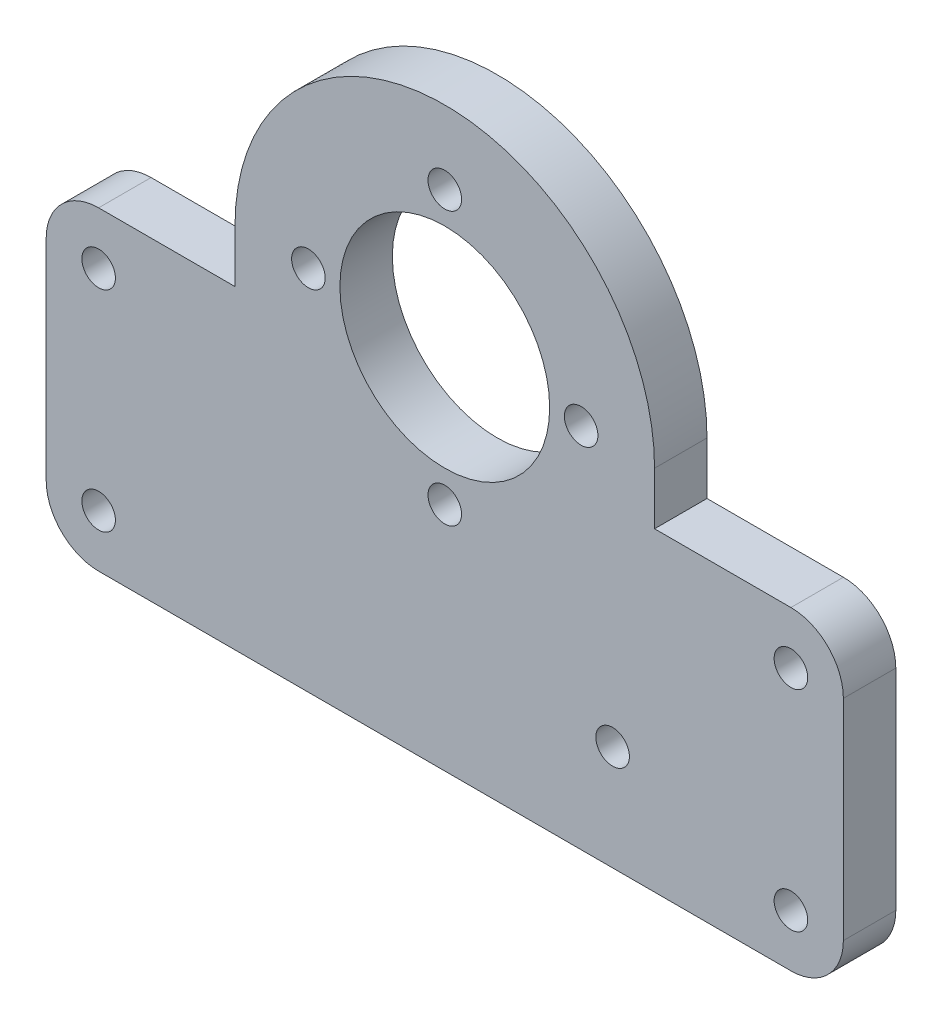
ISO-10303-21;
HEADER;
FILE_DESCRIPTION(('STEP AP214'),'2;1');
FILE_NAME('part.step','',(''),(''),'','','');
FILE_SCHEMA(('AUTOMOTIVE_DESIGN { 1 0 10303 214 1 1 1 1 }'));
ENDSEC;
DATA;
#1=APPLICATION_CONTEXT('core data for automotive mechanical design processes');
#2=APPLICATION_PROTOCOL_DEFINITION('international standard','automotive_design',2000,#1);
#3=PRODUCT_CONTEXT('',#1,'mechanical');
#4=PRODUCT('Part','Part','',(#3));
#5=PRODUCT_RELATED_PRODUCT_CATEGORY('part','',(#4));
#6=PRODUCT_DEFINITION_FORMATION('','',#4);
#7=PRODUCT_DEFINITION_CONTEXT('part definition',#1,'design');
#8=PRODUCT_DEFINITION('design','',#6,#7);
#9=PRODUCT_DEFINITION_SHAPE('','',#8);
#10=(LENGTH_UNIT() NAMED_UNIT(*) SI_UNIT(.MILLI.,.METRE.));
#11=(NAMED_UNIT(*) PLANE_ANGLE_UNIT() SI_UNIT($,.RADIAN.));
#12=(NAMED_UNIT(*) SI_UNIT($,.STERADIAN.) SOLID_ANGLE_UNIT());
#13=UNCERTAINTY_MEASURE_WITH_UNIT(LENGTH_MEASURE(1.E-05),#10,'distance_accuracy_value','');
#14=(GEOMETRIC_REPRESENTATION_CONTEXT(3) GLOBAL_UNCERTAINTY_ASSIGNED_CONTEXT((#13)) GLOBAL_UNIT_ASSIGNED_CONTEXT((#10,
#11,#12)) REPRESENTATION_CONTEXT('',''));
#15=CARTESIAN_POINT('',(0.,0.,0.));
#16=DIRECTION('',(0.,0.,1.));
#17=DIRECTION('',(1.,0.,0.));
#18=AXIS2_PLACEMENT_3D('',#15,#16,#17);
#19=CARTESIAN_POINT('',(38.,-30.,5.));
#20=DIRECTION('',(-1.,0.,0.));
#21=DIRECTION('',(0.,0.,1.));
#22=AXIS2_PLACEMENT_3D('',#19,#20,#21);
#23=PLANE('',#22);
#24=DIRECTION('',(0.,1.,0.));
#25=VECTOR('',#24,1.);
#26=CARTESIAN_POINT('',(38.,-30.,0.));
#27=LINE('',#26,#25);
#28=CARTESIAN_POINT('',(38.,-25.,0.));
#29=VERTEX_POINT('',#28);
#30=CARTESIAN_POINT('',(38.,-5.,0.));
#31=VERTEX_POINT('',#30);
#32=EDGE_CURVE('E287',#29,#31,#27,.T.);
#33=ORIENTED_EDGE('',*,*,#32,.T.);
#34=DIRECTION('',(0.,0.,-1.));
#35=VECTOR('',#34,1.);
#36=CARTESIAN_POINT('',(38.,-5.,5.));
#37=LINE('',#36,#35);
#38=CARTESIAN_POINT('',(38.,-5.,5.));
#39=VERTEX_POINT('',#38);
#40=EDGE_CURVE('E12',#31,#39,#37,.F.);
#41=ORIENTED_EDGE('',*,*,#40,.T.);
#42=DIRECTION('',(0.,1.,0.));
#43=VECTOR('',#42,1.);
#44=CARTESIAN_POINT('',(38.,-30.,5.));
#45=LINE('',#44,#43);
#46=CARTESIAN_POINT('',(38.,-25.,5.));
#47=VERTEX_POINT('',#46);
#48=EDGE_CURVE('E301',#47,#39,#45,.T.);
#49=ORIENTED_EDGE('',*,*,#48,.F.);
#50=DIRECTION('',(0.,0.,-1.));
#51=VECTOR('',#50,1.);
#52=CARTESIAN_POINT('',(38.,-25.,5.));
#53=LINE('',#52,#51);
#54=EDGE_CURVE('E335',#47,#29,#53,.T.);
#55=ORIENTED_EDGE('',*,*,#54,.T.);
#56=EDGE_LOOP('',(#33,#41,#49,#55));
#57=FACE_BOUND('',#56,.T.);
#58=ADVANCED_FACE('F37',(#57),#23,.F.);
#59=CARTESIAN_POINT('',(-38.,-30.,5.));
#60=DIRECTION('',(1.,0.,0.));
#61=DIRECTION('',(0.,0.,-1.));
#62=AXIS2_PLACEMENT_3D('',#59,#60,#61);
#63=PLANE('',#62);
#64=DIRECTION('',(0.,-1.,0.));
#65=VECTOR('',#64,1.);
#66=CARTESIAN_POINT('',(-38.,-30.,5.));
#67=LINE('',#66,#65);
#68=CARTESIAN_POINT('',(-38.,-5.,5.));
#69=VERTEX_POINT('',#68);
#70=CARTESIAN_POINT('',(-38.,-25.,5.));
#71=VERTEX_POINT('',#70);
#72=EDGE_CURVE('E298',#69,#71,#67,.T.);
#73=ORIENTED_EDGE('',*,*,#72,.F.);
#74=DIRECTION('',(0.,0.,-1.));
#75=VECTOR('',#74,1.);
#76=CARTESIAN_POINT('',(-38.,-5.,5.));
#77=LINE('',#76,#75);
#78=CARTESIAN_POINT('',(-38.,-5.,0.));
#79=VERTEX_POINT('',#78);
#80=EDGE_CURVE('E338',#69,#79,#77,.T.);
#81=ORIENTED_EDGE('',*,*,#80,.T.);
#82=DIRECTION('',(0.,-1.,0.));
#83=VECTOR('',#82,1.);
#84=CARTESIAN_POINT('',(-38.,-30.,0.));
#85=LINE('',#84,#83);
#86=CARTESIAN_POINT('',(-38.,-25.,0.));
#87=VERTEX_POINT('',#86);
#88=EDGE_CURVE('E314',#79,#87,#85,.T.);
#89=ORIENTED_EDGE('',*,*,#88,.T.);
#90=DIRECTION('',(0.,0.,-1.));
#91=VECTOR('',#90,1.);
#92=CARTESIAN_POINT('',(-38.,-25.,5.));
#93=LINE('',#92,#91);
#94=EDGE_CURVE('E328',#87,#71,#93,.F.);
#95=ORIENTED_EDGE('',*,*,#94,.T.);
#96=EDGE_LOOP('',(#73,#81,#89,#95));
#97=FACE_BOUND('',#96,.T.);
#98=ADVANCED_FACE('F357',(#97),#63,.F.);
#99=CARTESIAN_POINT('',(-38.,-30.,5.));
#100=DIRECTION('',(0.,1.,0.));
#101=DIRECTION('',(0.,0.,1.));
#102=AXIS2_PLACEMENT_3D('',#99,#100,#101);
#103=PLANE('',#102);
#104=DIRECTION('',(1.,0.,0.));
#105=VECTOR('',#104,1.);
#106=CARTESIAN_POINT('',(-38.,-30.,5.));
#107=LINE('',#106,#105);
#108=CARTESIAN_POINT('',(-33.,-30.,5.));
#109=VERTEX_POINT('',#108);
#110=CARTESIAN_POINT('',(33.,-30.,5.));
#111=VERTEX_POINT('',#110);
#112=EDGE_CURVE('E300',#109,#111,#107,.T.);
#113=ORIENTED_EDGE('',*,*,#112,.F.);
#114=DIRECTION('',(0.,0.,-1.));
#115=VECTOR('',#114,1.);
#116=CARTESIAN_POINT('',(-33.,-30.,5.));
#117=LINE('',#116,#115);
#118=CARTESIAN_POINT('',(-33.,-30.,0.));
#119=VERTEX_POINT('',#118);
#120=EDGE_CURVE('E320',#109,#119,#117,.T.);
#121=ORIENTED_EDGE('',*,*,#120,.T.);
#122=DIRECTION('',(1.,0.,0.));
#123=VECTOR('',#122,1.);
#124=CARTESIAN_POINT('',(-38.,-30.,0.));
#125=LINE('',#124,#123);
#126=CARTESIAN_POINT('',(33.,-30.,0.));
#127=VERTEX_POINT('',#126);
#128=EDGE_CURVE('E316',#119,#127,#125,.T.);
#129=ORIENTED_EDGE('',*,*,#128,.T.);
#130=DIRECTION('',(0.,0.,-1.));
#131=VECTOR('',#130,1.);
#132=CARTESIAN_POINT('',(33.,-30.,5.));
#133=LINE('',#132,#131);
#134=EDGE_CURVE('E310',#127,#111,#133,.F.);
#135=ORIENTED_EDGE('',*,*,#134,.T.);
#136=EDGE_LOOP('',(#113,#121,#129,#135));
#137=FACE_BOUND('',#136,.T.);
#138=ADVANCED_FACE('F381',(#137),#103,.F.);
#139=CARTESIAN_POINT('',(0.,0.,5.));
#140=DIRECTION('',(0.,0.,-1.));
#141=DIRECTION('',(-1.,0.,0.));
#142=AXIS2_PLACEMENT_3D('',#139,#140,#141);
#143=PLANE('',#142);
#144=CARTESIAN_POINT('',(16.,-20.,5.));
#145=DIRECTION('',(0.,0.,1.));
#146=DIRECTION('',(1.,0.,0.));
#147=AXIS2_PLACEMENT_3D('',#144,#145,#146);
#148=CIRCLE('',#147,1.6);
#149=CARTESIAN_POINT('',(17.6,-20.,5.));
#150=VERTEX_POINT('',#149);
#151=EDGE_CURVE('E202',#150,#150,#148,.T.);
#152=ORIENTED_EDGE('',*,*,#151,.F.);
#153=EDGE_LOOP('',(#152));
#154=FACE_BOUND('',#153,.T.);
#155=CARTESIAN_POINT('',(0.,18.,5.));
#156=DIRECTION('',(0.,0.,-1.));
#157=DIRECTION('',(-1.,0.,0.));
#158=AXIS2_PLACEMENT_3D('',#155,#156,#157);
#159=CIRCLE('',#158,1.6);
#160=CARTESIAN_POINT('',(-1.6,18.,5.));
#161=VERTEX_POINT('',#160);
#162=EDGE_CURVE('E213',#161,#161,#159,.T.);
#163=ORIENTED_EDGE('',*,*,#162,.T.);
#164=EDGE_LOOP('',(#163));
#165=FACE_BOUND('',#164,.T.);
#166=CARTESIAN_POINT('',(-13.0000000000002,5.00000000000014,5.));
#167=DIRECTION('',(0.,0.,-1.));
#168=DIRECTION('',(-1.,0.,0.));
#169=AXIS2_PLACEMENT_3D('',#166,#167,#168);
#170=CIRCLE('',#169,1.6);
#171=CARTESIAN_POINT('',(-14.6000000000002,5.00000000000014,5.));
#172=VERTEX_POINT('',#171);
#173=EDGE_CURVE('E218',#172,#172,#170,.T.);
#174=ORIENTED_EDGE('',*,*,#173,.T.);
#175=EDGE_LOOP('',(#174));
#176=FACE_BOUND('',#175,.T.);
#177=CARTESIAN_POINT('',(-2.73805120588741E-13,-8.,5.));
#178=DIRECTION('',(0.,0.,-1.));
#179=DIRECTION('',(-1.,0.,0.));
#180=AXIS2_PLACEMENT_3D('',#177,#178,#179);
#181=CIRCLE('',#180,1.6);
#182=CARTESIAN_POINT('',(-1.60000000000027,-8.,5.));
#183=VERTEX_POINT('',#182);
#184=EDGE_CURVE('E231',#183,#183,#181,.T.);
#185=ORIENTED_EDGE('',*,*,#184,.T.);
#186=EDGE_LOOP('',(#185));
#187=FACE_BOUND('',#186,.T.);
#188=CARTESIAN_POINT('',(12.9999999999998,4.99999999999996,5.));
#189=DIRECTION('',(0.,0.,-1.));
#190=DIRECTION('',(-1.,0.,0.));
#191=AXIS2_PLACEMENT_3D('',#188,#189,#190);
#192=CIRCLE('',#191,1.6);
#193=CARTESIAN_POINT('',(11.3999999999998,4.99999999999996,5.));
#194=VERTEX_POINT('',#193);
#195=EDGE_CURVE('E234',#194,#194,#192,.T.);
#196=ORIENTED_EDGE('',*,*,#195,.T.);
#197=EDGE_LOOP('',(#196));
#198=FACE_BOUND('',#197,.T.);
#199=CARTESIAN_POINT('',(0.,5.,5.));
#200=DIRECTION('',(0.,0.,-1.));
#201=DIRECTION('',(-1.,0.,0.));
#202=AXIS2_PLACEMENT_3D('',#199,#200,#201);
#203=CIRCLE('',#202,10.);
#204=CARTESIAN_POINT('',(-10.,5.,5.));
#205=VERTEX_POINT('',#204);
#206=EDGE_CURVE('E246',#205,#205,#203,.T.);
#207=ORIENTED_EDGE('',*,*,#206,.T.);
#208=EDGE_LOOP('',(#207));
#209=FACE_BOUND('',#208,.T.);
#210=CARTESIAN_POINT('',(33.,-25.,5.));
#211=DIRECTION('',(0.,0.,-1.));
#212=DIRECTION('',(-1.,0.,0.));
#213=AXIS2_PLACEMENT_3D('',#210,#211,#212);
#214=CIRCLE('',#213,1.6);
#215=CARTESIAN_POINT('',(31.4,-25.,5.));
#216=VERTEX_POINT('',#215);
#217=EDGE_CURVE('E260',#216,#216,#214,.T.);
#218=ORIENTED_EDGE('',*,*,#217,.T.);
#219=EDGE_LOOP('',(#218));
#220=FACE_BOUND('',#219,.T.);
#221=CARTESIAN_POINT('',(-33.,-5.,5.));
#222=DIRECTION('',(0.,0.,-1.));
#223=DIRECTION('',(-1.,0.,0.));
#224=AXIS2_PLACEMENT_3D('',#221,#222,#223);
#225=CIRCLE('',#224,1.6);
#226=CARTESIAN_POINT('',(-34.6,-5.,5.));
#227=VERTEX_POINT('',#226);
#228=EDGE_CURVE('E271',#227,#227,#225,.T.);
#229=ORIENTED_EDGE('',*,*,#228,.T.);
#230=EDGE_LOOP('',(#229));
#231=FACE_BOUND('',#230,.T.);
#232=CARTESIAN_POINT('',(-33.,-25.,5.));
#233=DIRECTION('',(0.,0.,-1.));
#234=DIRECTION('',(-1.,0.,0.));
#235=AXIS2_PLACEMENT_3D('',#232,#233,#234);
#236=CIRCLE('',#235,1.6);
#237=CARTESIAN_POINT('',(-34.6,-25.,5.));
#238=VERTEX_POINT('',#237);
#239=EDGE_CURVE('E221',#238,#238,#236,.T.);
#240=ORIENTED_EDGE('',*,*,#239,.T.);
#241=EDGE_LOOP('',(#240));
#242=FACE_BOUND('',#241,.T.);
#243=CARTESIAN_POINT('',(33.,-5.,5.));
#244=DIRECTION('',(0.,0.,-1.));
#245=DIRECTION('',(-1.,0.,0.));
#246=AXIS2_PLACEMENT_3D('',#243,#244,#245);
#247=CIRCLE('',#246,1.6);
#248=CARTESIAN_POINT('',(31.4,-5.,5.));
#249=VERTEX_POINT('',#248);
#250=EDGE_CURVE('E283',#249,#249,#247,.T.);
#251=ORIENTED_EDGE('',*,*,#250,.T.);
#252=EDGE_LOOP('',(#251));
#253=FACE_BOUND('',#252,.T.);
#254=DIRECTION('',(-1.,0.,0.));
#255=VECTOR('',#254,1.);
#256=CARTESIAN_POINT('',(0.,0.,5.));
#257=LINE('',#256,#255);
#258=CARTESIAN_POINT('',(-20.,0.,5.));
#259=VERTEX_POINT('',#258);
#260=CARTESIAN_POINT('',(-33.,0.,5.));
#261=VERTEX_POINT('',#260);
#262=EDGE_CURVE('E191',#259,#261,#257,.T.);
#263=ORIENTED_EDGE('',*,*,#262,.T.);
#264=CARTESIAN_POINT('',(-33.,-5.,5.));
#265=DIRECTION('',(0.,0.,-1.));
#266=DIRECTION('',(-1.,0.,0.));
#267=AXIS2_PLACEMENT_3D('',#264,#265,#266);
#268=CIRCLE('',#267,5.);
#269=EDGE_CURVE('E348',#261,#69,#268,.F.);
#270=ORIENTED_EDGE('',*,*,#269,.T.);
#271=ORIENTED_EDGE('',*,*,#72,.T.);
#272=CARTESIAN_POINT('',(-33.,-25.,5.));
#273=DIRECTION('',(0.,0.,-1.));
#274=DIRECTION('',(-1.,0.,0.));
#275=AXIS2_PLACEMENT_3D('',#272,#273,#274);
#276=CIRCLE('',#275,5.);
#277=EDGE_CURVE('E333',#71,#109,#276,.F.);
#278=ORIENTED_EDGE('',*,*,#277,.T.);
#279=ORIENTED_EDGE('',*,*,#112,.T.);
#280=CARTESIAN_POINT('',(33.,-25.,5.));
#281=DIRECTION('',(0.,0.,-1.));
#282=DIRECTION('',(-1.,0.,0.));
#283=AXIS2_PLACEMENT_3D('',#280,#281,#282);
#284=CIRCLE('',#283,5.);
#285=EDGE_CURVE('E331',#111,#47,#284,.F.);
#286=ORIENTED_EDGE('',*,*,#285,.T.);
#287=ORIENTED_EDGE('',*,*,#48,.T.);
#288=CARTESIAN_POINT('',(33.,-5.,5.));
#289=DIRECTION('',(0.,0.,-1.));
#290=DIRECTION('',(-1.,0.,0.));
#291=AXIS2_PLACEMENT_3D('',#288,#289,#290);
#292=CIRCLE('',#291,5.);
#293=CARTESIAN_POINT('',(33.,0.,5.));
#294=VERTEX_POINT('',#293);
#295=EDGE_CURVE('E52',#39,#294,#292,.F.);
#296=ORIENTED_EDGE('',*,*,#295,.T.);
#297=DIRECTION('',(-1.,0.,0.));
#298=VECTOR('',#297,1.);
#299=CARTESIAN_POINT('',(0.,0.,5.));
#300=LINE('',#299,#298);
#301=CARTESIAN_POINT('',(20.,0.,5.));
#302=VERTEX_POINT('',#301);
#303=EDGE_CURVE('E165',#294,#302,#300,.T.);
#304=ORIENTED_EDGE('',*,*,#303,.T.);
#305=DIRECTION('',(0.,1.,0.));
#306=VECTOR('',#305,1.);
#307=CARTESIAN_POINT('',(20.,0.,5.));
#308=LINE('',#307,#306);
#309=CARTESIAN_POINT('',(20.,5.,5.));
#310=VERTEX_POINT('',#309);
#311=EDGE_CURVE('E144',#302,#310,#308,.T.);
#312=ORIENTED_EDGE('',*,*,#311,.T.);
#313=CARTESIAN_POINT('',(0.,5.,5.));
#314=DIRECTION('',(0.,0.,-1.));
#315=DIRECTION('',(-1.,0.,0.));
#316=AXIS2_PLACEMENT_3D('',#313,#314,#315);
#317=CIRCLE('',#316,20.);
#318=CARTESIAN_POINT('',(-20.,5.,5.));
#319=VERTEX_POINT('',#318);
#320=EDGE_CURVE('E192',#310,#319,#317,.F.);
#321=ORIENTED_EDGE('',*,*,#320,.T.);
#322=DIRECTION('',(0.,-1.,0.));
#323=VECTOR('',#322,1.);
#324=CARTESIAN_POINT('',(-20.,0.,5.));
#325=LINE('',#324,#323);
#326=EDGE_CURVE('E187',#319,#259,#325,.T.);
#327=ORIENTED_EDGE('',*,*,#326,.T.);
#328=EDGE_LOOP('',(#263,#270,#271,#278,#279,#286,#287,#296,#304,#312,#321,#327));
#329=FACE_BOUND('',#328,.T.);
#330=ADVANCED_FACE('F352',(#154,#165,#176,#187,#198,#209,#220,#231,#242,#253,#329),#143,.F.);
#331=CARTESIAN_POINT('',(0.,0.,0.));
#332=DIRECTION('',(0.,0.,-1.));
#333=DIRECTION('',(-1.,0.,0.));
#334=AXIS2_PLACEMENT_3D('',#331,#332,#333);
#335=PLANE('',#334);
#336=CARTESIAN_POINT('',(16.,-20.,0.));
#337=DIRECTION('',(0.,0.,1.));
#338=DIRECTION('',(1.,0.,0.));
#339=AXIS2_PLACEMENT_3D('',#336,#337,#338);
#340=CIRCLE('',#339,1.6);
#341=CARTESIAN_POINT('',(17.6,-20.,0.));
#342=VERTEX_POINT('',#341);
#343=EDGE_CURVE('E135',#342,#342,#340,.T.);
#344=ORIENTED_EDGE('',*,*,#343,.T.);
#345=EDGE_LOOP('',(#344));
#346=FACE_BOUND('',#345,.T.);
#347=ORIENTED_EDGE('',*,*,#88,.F.);
#348=CARTESIAN_POINT('',(-33.,-5.,0.));
#349=DIRECTION('',(0.,0.,-1.));
#350=DIRECTION('',(-1.,0.,0.));
#351=AXIS2_PLACEMENT_3D('',#348,#349,#350);
#352=CIRCLE('',#351,5.);
#353=CARTESIAN_POINT('',(-33.,0.,0.));
#354=VERTEX_POINT('',#353);
#355=EDGE_CURVE('E343',#79,#354,#352,.T.);
#356=ORIENTED_EDGE('',*,*,#355,.T.);
#357=DIRECTION('',(-1.,0.,0.));
#358=VECTOR('',#357,1.);
#359=CARTESIAN_POINT('',(-20.,0.,0.));
#360=LINE('',#359,#358);
#361=CARTESIAN_POINT('',(-20.,0.,0.));
#362=VERTEX_POINT('',#361);
#363=EDGE_CURVE('E146',#362,#354,#360,.T.);
#364=ORIENTED_EDGE('',*,*,#363,.F.);
#365=DIRECTION('',(0.,-1.,0.));
#366=VECTOR('',#365,1.);
#367=CARTESIAN_POINT('',(-20.,5.,0.));
#368=LINE('',#367,#366);
#369=CARTESIAN_POINT('',(-20.,5.,0.));
#370=VERTEX_POINT('',#369);
#371=EDGE_CURVE('E155',#370,#362,#368,.T.);
#372=ORIENTED_EDGE('',*,*,#371,.F.);
#373=CARTESIAN_POINT('',(0.,5.,0.));
#374=DIRECTION('',(0.,0.,1.));
#375=DIRECTION('',(1.,0.,0.));
#376=AXIS2_PLACEMENT_3D('',#373,#374,#375);
#377=CIRCLE('',#376,20.);
#378=CARTESIAN_POINT('',(20.,5.,0.));
#379=VERTEX_POINT('',#378);
#380=EDGE_CURVE('E153',#379,#370,#377,.T.);
#381=ORIENTED_EDGE('',*,*,#380,.F.);
#382=DIRECTION('',(0.,1.,0.));
#383=VECTOR('',#382,1.);
#384=CARTESIAN_POINT('',(20.,5.,0.));
#385=LINE('',#384,#383);
#386=CARTESIAN_POINT('',(20.,0.,0.));
#387=VERTEX_POINT('',#386);
#388=EDGE_CURVE('E134',#387,#379,#385,.T.);
#389=ORIENTED_EDGE('',*,*,#388,.F.);
#390=DIRECTION('',(-1.,0.,0.));
#391=VECTOR('',#390,1.);
#392=CARTESIAN_POINT('',(38.,0.,0.));
#393=LINE('',#392,#391);
#394=CARTESIAN_POINT('',(33.,0.,0.));
#395=VERTEX_POINT('',#394);
#396=EDGE_CURVE('E127',#395,#387,#393,.T.);
#397=ORIENTED_EDGE('',*,*,#396,.F.);
#398=CARTESIAN_POINT('',(33.,-5.,0.));
#399=DIRECTION('',(0.,0.,-1.));
#400=DIRECTION('',(-1.,0.,0.));
#401=AXIS2_PLACEMENT_3D('',#398,#399,#400);
#402=CIRCLE('',#401,5.);
#403=EDGE_CURVE('E341',#395,#31,#402,.T.);
#404=ORIENTED_EDGE('',*,*,#403,.T.);
#405=ORIENTED_EDGE('',*,*,#32,.F.);
#406=CARTESIAN_POINT('',(33.,-25.,0.));
#407=DIRECTION('',(0.,0.,-1.));
#408=DIRECTION('',(-1.,0.,0.));
#409=AXIS2_PLACEMENT_3D('',#406,#407,#408);
#410=CIRCLE('',#409,5.);
#411=EDGE_CURVE('E323',#29,#127,#410,.T.);
#412=ORIENTED_EDGE('',*,*,#411,.T.);
#413=ORIENTED_EDGE('',*,*,#128,.F.);
#414=CARTESIAN_POINT('',(-33.,-25.,0.));
#415=DIRECTION('',(0.,0.,-1.));
#416=DIRECTION('',(-1.,0.,0.));
#417=AXIS2_PLACEMENT_3D('',#414,#415,#416);
#418=CIRCLE('',#417,5.);
#419=EDGE_CURVE('E325',#119,#87,#418,.T.);
#420=ORIENTED_EDGE('',*,*,#419,.T.);
#421=EDGE_LOOP('',(#347,#356,#364,#372,#381,#389,#397,#404,#405,#412,#413,#420));
#422=FACE_BOUND('',#421,.T.);
#423=CARTESIAN_POINT('',(0.,18.,0.));
#424=DIRECTION('',(0.,0.,-1.));
#425=DIRECTION('',(-1.,0.,0.));
#426=AXIS2_PLACEMENT_3D('',#423,#424,#425);
#427=CIRCLE('',#426,1.6);
#428=CARTESIAN_POINT('',(-1.6,18.,0.));
#429=VERTEX_POINT('',#428);
#430=EDGE_CURVE('E650',#429,#429,#427,.T.);
#431=ORIENTED_EDGE('',*,*,#430,.F.);
#432=EDGE_LOOP('',(#431));
#433=FACE_BOUND('',#432,.T.);
#434=CARTESIAN_POINT('',(-13.0000000000002,5.00000000000014,0.));
#435=DIRECTION('',(0.,0.,-1.));
#436=DIRECTION('',(-1.,0.,0.));
#437=AXIS2_PLACEMENT_3D('',#434,#435,#436);
#438=CIRCLE('',#437,1.6);
#439=CARTESIAN_POINT('',(-14.6000000000002,5.00000000000014,0.));
#440=VERTEX_POINT('',#439);
#441=EDGE_CURVE('E647',#440,#440,#438,.T.);
#442=ORIENTED_EDGE('',*,*,#441,.F.);
#443=EDGE_LOOP('',(#442));
#444=FACE_BOUND('',#443,.T.);
#445=CARTESIAN_POINT('',(-2.73805120588741E-13,-8.,0.));
#446=DIRECTION('',(0.,0.,-1.));
#447=DIRECTION('',(-1.,0.,0.));
#448=AXIS2_PLACEMENT_3D('',#445,#446,#447);
#449=CIRCLE('',#448,1.6);
#450=CARTESIAN_POINT('',(-1.60000000000027,-8.,0.));
#451=VERTEX_POINT('',#450);
#452=EDGE_CURVE('E645',#451,#451,#449,.T.);
#453=ORIENTED_EDGE('',*,*,#452,.F.);
#454=EDGE_LOOP('',(#453));
#455=FACE_BOUND('',#454,.T.);
#456=CARTESIAN_POINT('',(12.9999999999998,4.99999999999996,0.));
#457=DIRECTION('',(0.,0.,-1.));
#458=DIRECTION('',(-1.,0.,0.));
#459=AXIS2_PLACEMENT_3D('',#456,#457,#458);
#460=CIRCLE('',#459,1.6);
#461=CARTESIAN_POINT('',(11.3999999999998,4.99999999999996,0.));
#462=VERTEX_POINT('',#461);
#463=EDGE_CURVE('E648',#462,#462,#460,.T.);
#464=ORIENTED_EDGE('',*,*,#463,.F.);
#465=EDGE_LOOP('',(#464));
#466=FACE_BOUND('',#465,.T.);
#467=CARTESIAN_POINT('',(0.,5.,0.));
#468=DIRECTION('',(0.,0.,-1.));
#469=DIRECTION('',(-1.,0.,0.));
#470=AXIS2_PLACEMENT_3D('',#467,#468,#469);
#471=CIRCLE('',#470,10.);
#472=CARTESIAN_POINT('',(-10.,5.,0.));
#473=VERTEX_POINT('',#472);
#474=EDGE_CURVE('E250',#473,#473,#471,.T.);
#475=ORIENTED_EDGE('',*,*,#474,.F.);
#476=EDGE_LOOP('',(#475));
#477=FACE_BOUND('',#476,.T.);
#478=CARTESIAN_POINT('',(33.,-25.,0.));
#479=DIRECTION('',(0.,0.,-1.));
#480=DIRECTION('',(-1.,0.,0.));
#481=AXIS2_PLACEMENT_3D('',#478,#479,#480);
#482=CIRCLE('',#481,1.6);
#483=CARTESIAN_POINT('',(31.4,-25.,0.));
#484=VERTEX_POINT('',#483);
#485=EDGE_CURVE('E265',#484,#484,#482,.T.);
#486=ORIENTED_EDGE('',*,*,#485,.F.);
#487=EDGE_LOOP('',(#486));
#488=FACE_BOUND('',#487,.T.);
#489=CARTESIAN_POINT('',(-33.,-5.,0.));
#490=DIRECTION('',(0.,0.,-1.));
#491=DIRECTION('',(-1.,0.,0.));
#492=AXIS2_PLACEMENT_3D('',#489,#490,#491);
#493=CIRCLE('',#492,1.6);
#494=CARTESIAN_POINT('',(-34.6,-5.,0.));
#495=VERTEX_POINT('',#494);
#496=EDGE_CURVE('E275',#495,#495,#493,.T.);
#497=ORIENTED_EDGE('',*,*,#496,.F.);
#498=EDGE_LOOP('',(#497));
#499=FACE_BOUND('',#498,.T.);
#500=CARTESIAN_POINT('',(-33.,-25.,0.));
#501=DIRECTION('',(0.,0.,-1.));
#502=DIRECTION('',(-1.,0.,0.));
#503=AXIS2_PLACEMENT_3D('',#500,#501,#502);
#504=CIRCLE('',#503,1.6);
#505=CARTESIAN_POINT('',(-34.6,-25.,0.));
#506=VERTEX_POINT('',#505);
#507=EDGE_CURVE('E217',#506,#506,#504,.T.);
#508=ORIENTED_EDGE('',*,*,#507,.F.);
#509=EDGE_LOOP('',(#508));
#510=FACE_BOUND('',#509,.T.);
#511=CARTESIAN_POINT('',(33.,-5.,0.));
#512=DIRECTION('',(0.,0.,-1.));
#513=DIRECTION('',(-1.,0.,0.));
#514=AXIS2_PLACEMENT_3D('',#511,#512,#513);
#515=CIRCLE('',#514,1.6);
#516=CARTESIAN_POINT('',(31.4,-5.,0.));
#517=VERTEX_POINT('',#516);
#518=EDGE_CURVE('E264',#517,#517,#515,.T.);
#519=ORIENTED_EDGE('',*,*,#518,.F.);
#520=EDGE_LOOP('',(#519));
#521=FACE_BOUND('',#520,.T.);
#522=ADVANCED_FACE('F149',(#346,#422,#433,#444,#455,#466,#477,#488,#499,#510,#521),#335,.T.);
#523=CARTESIAN_POINT('',(-33.,-25.,5.));
#524=DIRECTION('',(0.,0.,-1.));
#525=DIRECTION('',(-1.,0.,0.));
#526=AXIS2_PLACEMENT_3D('',#523,#524,#525);
#527=CYLINDRICAL_SURFACE('',#526,5.);
#528=ORIENTED_EDGE('',*,*,#277,.F.);
#529=ORIENTED_EDGE('',*,*,#94,.F.);
#530=ORIENTED_EDGE('',*,*,#419,.F.);
#531=ORIENTED_EDGE('',*,*,#120,.F.);
#532=EDGE_LOOP('',(#528,#529,#530,#531));
#533=FACE_BOUND('',#532,.T.);
#534=ADVANCED_FACE('F384',(#533),#527,.T.);
#535=CARTESIAN_POINT('',(33.,-25.,5.));
#536=DIRECTION('',(0.,0.,-1.));
#537=DIRECTION('',(-1.,0.,0.));
#538=AXIS2_PLACEMENT_3D('',#535,#536,#537);
#539=CYLINDRICAL_SURFACE('',#538,5.);
#540=ORIENTED_EDGE('',*,*,#285,.F.);
#541=ORIENTED_EDGE('',*,*,#134,.F.);
#542=ORIENTED_EDGE('',*,*,#411,.F.);
#543=ORIENTED_EDGE('',*,*,#54,.F.);
#544=EDGE_LOOP('',(#540,#541,#542,#543));
#545=FACE_BOUND('',#544,.T.);
#546=ADVANCED_FACE('F376',(#545),#539,.T.);
#547=CARTESIAN_POINT('',(33.,-5.,5.));
#548=DIRECTION('',(0.,0.,-1.));
#549=DIRECTION('',(-1.,0.,0.));
#550=AXIS2_PLACEMENT_3D('',#547,#548,#549);
#551=CYLINDRICAL_SURFACE('',#550,1.6);
#552=ORIENTED_EDGE('',*,*,#250,.F.);
#553=EDGE_LOOP('',(#552));
#554=FACE_BOUND('',#553,.T.);
#555=ORIENTED_EDGE('',*,*,#518,.T.);
#556=EDGE_LOOP('',(#555));
#557=FACE_BOUND('',#556,.T.);
#558=ADVANCED_FACE('F391',(#554,#557),#551,.F.);
#559=CARTESIAN_POINT('',(-33.,-25.,5.));
#560=DIRECTION('',(0.,0.,-1.));
#561=DIRECTION('',(-1.,0.,0.));
#562=AXIS2_PLACEMENT_3D('',#559,#560,#561);
#563=CYLINDRICAL_SURFACE('',#562,1.6);
#564=ORIENTED_EDGE('',*,*,#239,.F.);
#565=EDGE_LOOP('',(#564));
#566=FACE_BOUND('',#565,.T.);
#567=ORIENTED_EDGE('',*,*,#507,.T.);
#568=EDGE_LOOP('',(#567));
#569=FACE_BOUND('',#568,.T.);
#570=ADVANCED_FACE('F409',(#566,#569),#563,.F.);
#571=CARTESIAN_POINT('',(-33.,-5.,5.));
#572=DIRECTION('',(0.,0.,-1.));
#573=DIRECTION('',(-1.,0.,0.));
#574=AXIS2_PLACEMENT_3D('',#571,#572,#573);
#575=CYLINDRICAL_SURFACE('',#574,1.6);
#576=ORIENTED_EDGE('',*,*,#228,.F.);
#577=EDGE_LOOP('',(#576));
#578=FACE_BOUND('',#577,.T.);
#579=ORIENTED_EDGE('',*,*,#496,.T.);
#580=EDGE_LOOP('',(#579));
#581=FACE_BOUND('',#580,.T.);
#582=ADVANCED_FACE('F411',(#578,#581),#575,.F.);
#583=CARTESIAN_POINT('',(33.,-25.,5.));
#584=DIRECTION('',(0.,0.,-1.));
#585=DIRECTION('',(-1.,0.,0.));
#586=AXIS2_PLACEMENT_3D('',#583,#584,#585);
#587=CYLINDRICAL_SURFACE('',#586,1.6);
#588=ORIENTED_EDGE('',*,*,#217,.F.);
#589=EDGE_LOOP('',(#588));
#590=FACE_BOUND('',#589,.T.);
#591=ORIENTED_EDGE('',*,*,#485,.T.);
#592=EDGE_LOOP('',(#591));
#593=FACE_BOUND('',#592,.T.);
#594=ADVANCED_FACE('F414',(#590,#593),#587,.F.);
#595=CARTESIAN_POINT('',(0.,5.,10.));
#596=DIRECTION('',(0.,0.,-1.));
#597=DIRECTION('',(-1.,0.,0.));
#598=AXIS2_PLACEMENT_3D('',#595,#596,#597);
#599=CYLINDRICAL_SURFACE('',#598,10.);
#600=ORIENTED_EDGE('',*,*,#474,.T.);
#601=EDGE_LOOP('',(#600));
#602=FACE_BOUND('',#601,.T.);
#603=ORIENTED_EDGE('',*,*,#206,.F.);
#604=EDGE_LOOP('',(#603));
#605=FACE_BOUND('',#604,.T.);
#606=ADVANCED_FACE('F418',(#602,#605),#599,.F.);
#607=CARTESIAN_POINT('',(12.9999999999998,4.99999999999996,10.));
#608=DIRECTION('',(0.,0.,-1.));
#609=DIRECTION('',(-1.,0.,0.));
#610=AXIS2_PLACEMENT_3D('',#607,#608,#609);
#611=CYLINDRICAL_SURFACE('',#610,1.6);
#612=ORIENTED_EDGE('',*,*,#463,.T.);
#613=EDGE_LOOP('',(#612));
#614=FACE_BOUND('',#613,.T.);
#615=ORIENTED_EDGE('',*,*,#195,.F.);
#616=EDGE_LOOP('',(#615));
#617=FACE_BOUND('',#616,.T.);
#618=ADVANCED_FACE('F425',(#614,#617),#611,.F.);
#619=CARTESIAN_POINT('',(-2.73805120588741E-13,-8.,10.));
#620=DIRECTION('',(0.,0.,-1.));
#621=DIRECTION('',(-1.,0.,0.));
#622=AXIS2_PLACEMENT_3D('',#619,#620,#621);
#623=CYLINDRICAL_SURFACE('',#622,1.6);
#624=ORIENTED_EDGE('',*,*,#452,.T.);
#625=EDGE_LOOP('',(#624));
#626=FACE_BOUND('',#625,.T.);
#627=ORIENTED_EDGE('',*,*,#184,.F.);
#628=EDGE_LOOP('',(#627));
#629=FACE_BOUND('',#628,.T.);
#630=ADVANCED_FACE('F431',(#626,#629),#623,.F.);
#631=CARTESIAN_POINT('',(-13.0000000000002,5.00000000000014,10.));
#632=DIRECTION('',(0.,0.,-1.));
#633=DIRECTION('',(-1.,0.,0.));
#634=AXIS2_PLACEMENT_3D('',#631,#632,#633);
#635=CYLINDRICAL_SURFACE('',#634,1.6);
#636=ORIENTED_EDGE('',*,*,#441,.T.);
#637=EDGE_LOOP('',(#636));
#638=FACE_BOUND('',#637,.T.);
#639=ORIENTED_EDGE('',*,*,#173,.F.);
#640=EDGE_LOOP('',(#639));
#641=FACE_BOUND('',#640,.T.);
#642=ADVANCED_FACE('F427',(#638,#641),#635,.F.);
#643=CARTESIAN_POINT('',(0.,18.,10.));
#644=DIRECTION('',(0.,0.,-1.));
#645=DIRECTION('',(-1.,0.,0.));
#646=AXIS2_PLACEMENT_3D('',#643,#644,#645);
#647=CYLINDRICAL_SURFACE('',#646,1.6);
#648=ORIENTED_EDGE('',*,*,#430,.T.);
#649=EDGE_LOOP('',(#648));
#650=FACE_BOUND('',#649,.T.);
#651=ORIENTED_EDGE('',*,*,#162,.F.);
#652=EDGE_LOOP('',(#651));
#653=FACE_BOUND('',#652,.T.);
#654=ADVANCED_FACE('F430',(#650,#653),#647,.F.);
#655=CARTESIAN_POINT('',(-20.,0.,13.5));
#656=DIRECTION('',(0.,-1.,0.));
#657=DIRECTION('',(0.,0.,-1.));
#658=AXIS2_PLACEMENT_3D('',#655,#656,#657);
#659=PLANE('',#658);
#660=ORIENTED_EDGE('',*,*,#363,.T.);
#661=DIRECTION('',(0.,0.,-1.));
#662=VECTOR('',#661,1.);
#663=CARTESIAN_POINT('',(-33.,0.,13.5));
#664=LINE('',#663,#662);
#665=EDGE_CURVE('E345',#354,#261,#664,.F.);
#666=ORIENTED_EDGE('',*,*,#665,.T.);
#667=ORIENTED_EDGE('',*,*,#262,.F.);
#668=DIRECTION('',(0.,0.,-1.));
#669=VECTOR('',#668,1.);
#670=CARTESIAN_POINT('',(-20.,0.,13.5));
#671=LINE('',#670,#669);
#672=EDGE_CURVE('E163',#259,#362,#671,.T.);
#673=ORIENTED_EDGE('',*,*,#672,.T.);
#674=EDGE_LOOP('',(#660,#666,#667,#673));
#675=FACE_BOUND('',#674,.T.);
#676=ADVANCED_FACE('F363',(#675),#659,.F.);
#677=CARTESIAN_POINT('',(-20.,5.,13.5));
#678=DIRECTION('',(1.,0.,0.));
#679=DIRECTION('',(0.,0.,-1.));
#680=AXIS2_PLACEMENT_3D('',#677,#678,#679);
#681=PLANE('',#680);
#682=DIRECTION('',(0.,0.,-1.));
#683=VECTOR('',#682,1.);
#684=CARTESIAN_POINT('',(-20.,5.,13.5));
#685=LINE('',#684,#683);
#686=EDGE_CURVE('E166',#319,#370,#685,.T.);
#687=ORIENTED_EDGE('',*,*,#686,.T.);
#688=ORIENTED_EDGE('',*,*,#371,.T.);
#689=ORIENTED_EDGE('',*,*,#672,.F.);
#690=ORIENTED_EDGE('',*,*,#326,.F.);
#691=EDGE_LOOP('',(#687,#688,#689,#690));
#692=FACE_BOUND('',#691,.T.);
#693=ADVANCED_FACE('F366',(#692),#681,.F.);
#694=CARTESIAN_POINT('',(0.,5.,13.5));
#695=DIRECTION('',(0.,0.,-1.));
#696=DIRECTION('',(-1.,0.,0.));
#697=AXIS2_PLACEMENT_3D('',#694,#695,#696);
#698=CYLINDRICAL_SURFACE('',#697,20.);
#699=DIRECTION('',(0.,0.,-1.));
#700=VECTOR('',#699,1.);
#701=CARTESIAN_POINT('',(20.,5.,13.5));
#702=LINE('',#701,#700);
#703=EDGE_CURVE('E145',#310,#379,#702,.T.);
#704=ORIENTED_EDGE('',*,*,#703,.T.);
#705=ORIENTED_EDGE('',*,*,#380,.T.);
#706=ORIENTED_EDGE('',*,*,#686,.F.);
#707=ORIENTED_EDGE('',*,*,#320,.F.);
#708=EDGE_LOOP('',(#704,#705,#706,#707));
#709=FACE_BOUND('',#708,.T.);
#710=ADVANCED_FACE('F370',(#709),#698,.T.);
#711=CARTESIAN_POINT('',(20.,5.,13.5));
#712=DIRECTION('',(-1.,0.,0.));
#713=DIRECTION('',(0.,0.,1.));
#714=AXIS2_PLACEMENT_3D('',#711,#712,#713);
#715=PLANE('',#714);
#716=DIRECTION('',(0.,0.,-1.));
#717=VECTOR('',#716,1.);
#718=CARTESIAN_POINT('',(20.,0.,13.5));
#719=LINE('',#718,#717);
#720=EDGE_CURVE('E130',#302,#387,#719,.T.);
#721=ORIENTED_EDGE('',*,*,#720,.T.);
#722=ORIENTED_EDGE('',*,*,#388,.T.);
#723=ORIENTED_EDGE('',*,*,#703,.F.);
#724=ORIENTED_EDGE('',*,*,#311,.F.);
#725=EDGE_LOOP('',(#721,#722,#723,#724));
#726=FACE_BOUND('',#725,.T.);
#727=ADVANCED_FACE('F140',(#726),#715,.F.);
#728=CARTESIAN_POINT('',(38.,0.,13.5));
#729=DIRECTION('',(0.,-1.,0.));
#730=DIRECTION('',(0.,0.,-1.));
#731=AXIS2_PLACEMENT_3D('',#728,#729,#730);
#732=PLANE('',#731);
#733=ORIENTED_EDGE('',*,*,#303,.F.);
#734=DIRECTION('',(0.,0.,-1.));
#735=VECTOR('',#734,1.);
#736=CARTESIAN_POINT('',(33.,0.,13.5));
#737=LINE('',#736,#735);
#738=EDGE_CURVE('E45',#294,#395,#737,.T.);
#739=ORIENTED_EDGE('',*,*,#738,.T.);
#740=ORIENTED_EDGE('',*,*,#396,.T.);
#741=ORIENTED_EDGE('',*,*,#720,.F.);
#742=EDGE_LOOP('',(#733,#739,#740,#741));
#743=FACE_BOUND('',#742,.T.);
#744=ADVANCED_FACE('F129',(#743),#732,.F.);
#745=CARTESIAN_POINT('',(-33.,-5.,5.));
#746=DIRECTION('',(0.,0.,-1.));
#747=DIRECTION('',(-1.,0.,0.));
#748=AXIS2_PLACEMENT_3D('',#745,#746,#747);
#749=CYLINDRICAL_SURFACE('',#748,5.);
#750=ORIENTED_EDGE('',*,*,#269,.F.);
#751=ORIENTED_EDGE('',*,*,#665,.F.);
#752=ORIENTED_EDGE('',*,*,#355,.F.);
#753=ORIENTED_EDGE('',*,*,#80,.F.);
#754=EDGE_LOOP('',(#750,#751,#752,#753));
#755=FACE_BOUND('',#754,.T.);
#756=ADVANCED_FACE('F360',(#755),#749,.T.);
#757=CARTESIAN_POINT('',(33.,-5.,13.5));
#758=DIRECTION('',(0.,0.,-1.));
#759=DIRECTION('',(-1.,0.,0.));
#760=AXIS2_PLACEMENT_3D('',#757,#758,#759);
#761=CYLINDRICAL_SURFACE('',#760,5.);
#762=ORIENTED_EDGE('',*,*,#295,.F.);
#763=ORIENTED_EDGE('',*,*,#40,.F.);
#764=ORIENTED_EDGE('',*,*,#403,.F.);
#765=ORIENTED_EDGE('',*,*,#738,.F.);
#766=EDGE_LOOP('',(#762,#763,#764,#765));
#767=FACE_BOUND('',#766,.T.);
#768=ADVANCED_FACE('F39',(#767),#761,.T.);
#769=CARTESIAN_POINT('',(16.,-20.,0.));
#770=DIRECTION('',(0.,0.,1.));
#771=DIRECTION('',(1.,0.,0.));
#772=AXIS2_PLACEMENT_3D('',#769,#770,#771);
#773=CYLINDRICAL_SURFACE('',#772,1.6);
#774=ORIENTED_EDGE('',*,*,#343,.F.);
#775=EDGE_LOOP('',(#774));
#776=FACE_BOUND('',#775,.T.);
#777=ORIENTED_EDGE('',*,*,#151,.T.);
#778=EDGE_LOOP('',(#777));
#779=FACE_BOUND('',#778,.T.);
#780=ADVANCED_FACE('F452',(#776,#779),#773,.F.);
#781=CLOSED_SHELL('',(#58,#98,#138,#330,#522,#534,#546,#558,#570,#582,#594,#606,#618,#630,#642,
#654,#676,#693,#710,#727,#744,#756,#768,#780));
#782=MANIFOLD_SOLID_BREP('B2',#781);
#783=ADVANCED_BREP_SHAPE_REPRESENTATION('',(#18,#782),#14);
#784=SHAPE_DEFINITION_REPRESENTATION(#9,#783);
ENDSEC;
END-ISO-10303-21;
